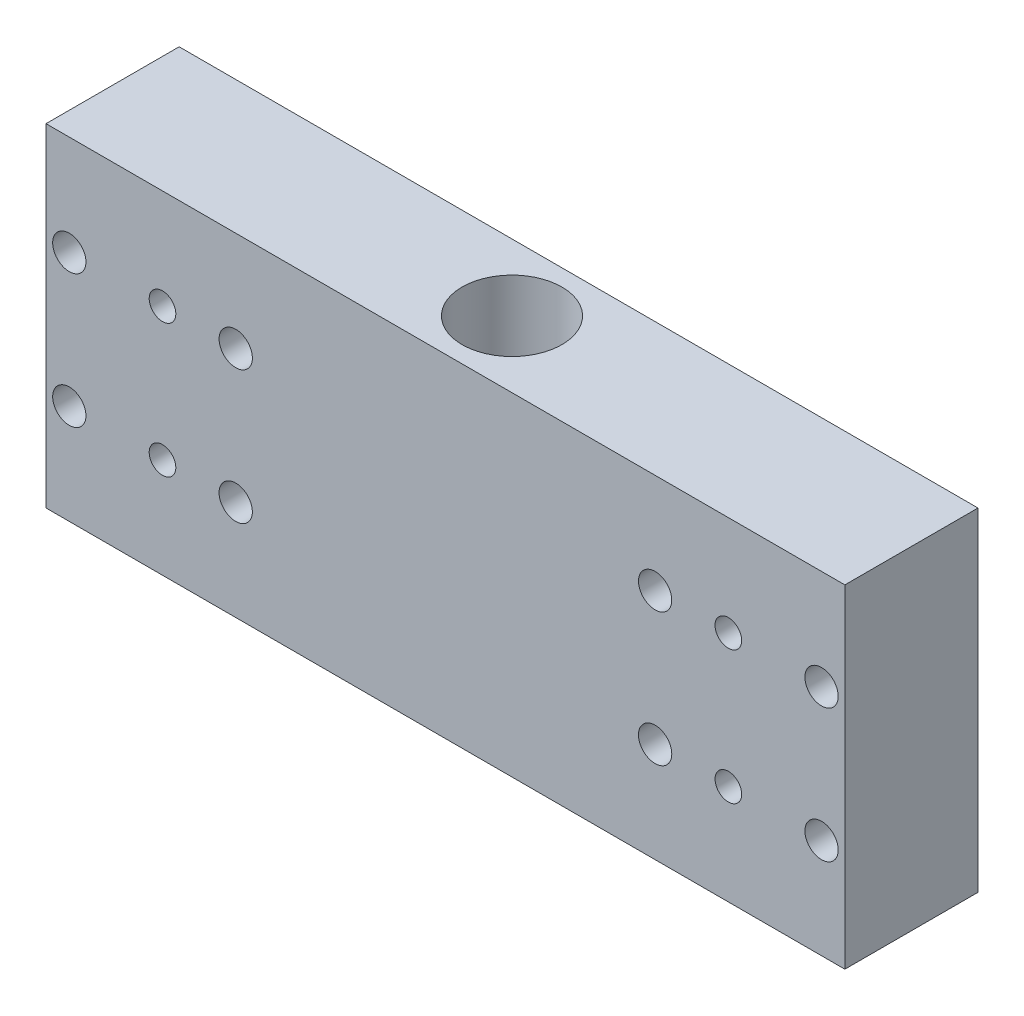
ISO-10303-21;
HEADER;
FILE_DESCRIPTION(('STEP AP214'),'2;1');
FILE_NAME('part.step','',(''),(''),'','','');
FILE_SCHEMA(('AUTOMOTIVE_DESIGN { 1 0 10303 214 1 1 1 1 }'));
ENDSEC;
DATA;
#1=APPLICATION_CONTEXT('core data for automotive mechanical design processes');
#2=APPLICATION_PROTOCOL_DEFINITION('international standard','automotive_design',2000,#1);
#3=PRODUCT_CONTEXT('',#1,'mechanical');
#4=PRODUCT('Part','Part','',(#3));
#5=PRODUCT_RELATED_PRODUCT_CATEGORY('part','',(#4));
#6=PRODUCT_DEFINITION_FORMATION('','',#4);
#7=PRODUCT_DEFINITION_CONTEXT('part definition',#1,'design');
#8=PRODUCT_DEFINITION('design','',#6,#7);
#9=PRODUCT_DEFINITION_SHAPE('','',#8);
#10=(LENGTH_UNIT() NAMED_UNIT(*) SI_UNIT(.MILLI.,.METRE.));
#11=(NAMED_UNIT(*) PLANE_ANGLE_UNIT() SI_UNIT($,.RADIAN.));
#12=(NAMED_UNIT(*) SI_UNIT($,.STERADIAN.) SOLID_ANGLE_UNIT());
#13=UNCERTAINTY_MEASURE_WITH_UNIT(LENGTH_MEASURE(1.E-05),#10,'distance_accuracy_value','');
#14=(GEOMETRIC_REPRESENTATION_CONTEXT(3) GLOBAL_UNCERTAINTY_ASSIGNED_CONTEXT((#13)) GLOBAL_UNIT_ASSIGNED_CONTEXT((#10,
#11,#12)) REPRESENTATION_CONTEXT('',''));
#15=CARTESIAN_POINT('',(0.,0.,0.));
#16=DIRECTION('',(0.,0.,1.));
#17=DIRECTION('',(1.,0.,0.));
#18=AXIS2_PLACEMENT_3D('',#15,#16,#17);
#19=CARTESIAN_POINT('',(-56.5,9.99999999999999,0.));
#20=DIRECTION('',(0.,0.,1.));
#21=DIRECTION('',(1.,0.,0.));
#22=AXIS2_PLACEMENT_3D('',#19,#20,#21);
#23=CYLINDRICAL_SURFACE('',#22,1.25);
#24=CARTESIAN_POINT('',(-56.5,9.99999999999999,0.));
#25=DIRECTION('',(0.,0.,1.));
#26=DIRECTION('',(1.,0.,0.));
#27=AXIS2_PLACEMENT_3D('',#24,#25,#26);
#28=CIRCLE('',#27,1.25);
#29=CARTESIAN_POINT('',(-55.25,9.99999999999999,0.));
#30=VERTEX_POINT('',#29);
#31=EDGE_CURVE('E103',#30,#30,#28,.T.);
#32=ORIENTED_EDGE('',*,*,#31,.F.);
#33=EDGE_LOOP('',(#32));
#34=FACE_BOUND('',#33,.T.);
#35=CARTESIAN_POINT('',(-56.5,9.99999999999999,15.));
#36=DIRECTION('',(0.,0.,1.));
#37=DIRECTION('',(1.,0.,0.));
#38=AXIS2_PLACEMENT_3D('',#35,#36,#37);
#39=CIRCLE('',#38,1.25);
#40=CARTESIAN_POINT('',(-55.25,9.99999999999999,15.));
#41=VERTEX_POINT('',#40);
#42=EDGE_CURVE('E37',#41,#41,#39,.F.);
#43=ORIENTED_EDGE('',*,*,#42,.F.);
#44=EDGE_LOOP('',(#43));
#45=FACE_BOUND('',#44,.T.);
#46=ADVANCED_FACE('F33',(#34,#45),#23,.F.);
#47=CARTESIAN_POINT('',(31.5,-9.99999999999999,0.));
#48=DIRECTION('',(0.,0.,1.));
#49=DIRECTION('',(1.,0.,0.));
#50=AXIS2_PLACEMENT_3D('',#47,#48,#49);
#51=CYLINDRICAL_SURFACE('',#50,1.25);
#52=CARTESIAN_POINT('',(31.5,-9.99999999999999,0.));
#53=DIRECTION('',(0.,0.,1.));
#54=DIRECTION('',(-1.,0.,0.));
#55=AXIS2_PLACEMENT_3D('',#52,#53,#54);
#56=CIRCLE('',#55,1.25);
#57=CARTESIAN_POINT('',(30.25,-9.99999999999999,0.));
#58=VERTEX_POINT('',#57);
#59=EDGE_CURVE('E141',#58,#58,#56,.T.);
#60=ORIENTED_EDGE('',*,*,#59,.F.);
#61=EDGE_LOOP('',(#60));
#62=FACE_BOUND('',#61,.T.);
#63=CARTESIAN_POINT('',(31.5,-9.99999999999999,15.));
#64=DIRECTION('',(0.,0.,1.));
#65=DIRECTION('',(1.,0.,0.));
#66=AXIS2_PLACEMENT_3D('',#63,#64,#65);
#67=CIRCLE('',#66,1.25);
#68=CARTESIAN_POINT('',(32.75,-9.99999999999999,15.));
#69=VERTEX_POINT('',#68);
#70=EDGE_CURVE('E122',#69,#69,#67,.F.);
#71=ORIENTED_EDGE('',*,*,#70,.F.);
#72=EDGE_LOOP('',(#71));
#73=FACE_BOUND('',#72,.T.);
#74=ADVANCED_FACE('F165',(#62,#73),#51,.F.);
#75=CARTESIAN_POINT('',(-31.5,9.99999999999999,0.));
#76=DIRECTION('',(0.,0.,1.));
#77=DIRECTION('',(1.,0.,0.));
#78=AXIS2_PLACEMENT_3D('',#75,#76,#77);
#79=CYLINDRICAL_SURFACE('',#78,1.25);
#80=CARTESIAN_POINT('',(-31.5,9.99999999999999,0.));
#81=DIRECTION('',(0.,0.,1.));
#82=DIRECTION('',(-1.,0.,0.));
#83=AXIS2_PLACEMENT_3D('',#80,#81,#82);
#84=CIRCLE('',#83,1.25);
#85=CARTESIAN_POINT('',(-32.75,9.99999999999999,0.));
#86=VERTEX_POINT('',#85);
#87=EDGE_CURVE('E152',#86,#86,#84,.T.);
#88=ORIENTED_EDGE('',*,*,#87,.F.);
#89=EDGE_LOOP('',(#88));
#90=FACE_BOUND('',#89,.T.);
#91=CARTESIAN_POINT('',(-31.5,9.99999999999999,15.));
#92=DIRECTION('',(0.,0.,1.));
#93=DIRECTION('',(1.,0.,0.));
#94=AXIS2_PLACEMENT_3D('',#91,#92,#93);
#95=CIRCLE('',#94,1.25);
#96=CARTESIAN_POINT('',(-30.25,9.99999999999999,15.));
#97=VERTEX_POINT('',#96);
#98=EDGE_CURVE('E119',#97,#97,#95,.F.);
#99=ORIENTED_EDGE('',*,*,#98,.F.);
#100=EDGE_LOOP('',(#99));
#101=FACE_BOUND('',#100,.T.);
#102=ADVANCED_FACE('F170',(#90,#101),#79,.F.);
#103=CARTESIAN_POINT('',(56.5,-10.,0.));
#104=DIRECTION('',(0.,0.,1.));
#105=DIRECTION('',(1.,0.,0.));
#106=AXIS2_PLACEMENT_3D('',#103,#104,#105);
#107=CYLINDRICAL_SURFACE('',#106,1.25);
#108=CARTESIAN_POINT('',(56.5,-10.,0.));
#109=DIRECTION('',(0.,0.,1.));
#110=DIRECTION('',(1.,0.,0.));
#111=AXIS2_PLACEMENT_3D('',#108,#109,#110);
#112=CIRCLE('',#111,1.25);
#113=CARTESIAN_POINT('',(57.75,-10.,0.));
#114=VERTEX_POINT('',#113);
#115=EDGE_CURVE('E149',#114,#114,#112,.T.);
#116=ORIENTED_EDGE('',*,*,#115,.F.);
#117=EDGE_LOOP('',(#116));
#118=FACE_BOUND('',#117,.T.);
#119=CARTESIAN_POINT('',(56.5,-10.,15.));
#120=DIRECTION('',(0.,0.,1.));
#121=DIRECTION('',(1.,0.,0.));
#122=AXIS2_PLACEMENT_3D('',#119,#120,#121);
#123=CIRCLE('',#122,1.25);
#124=CARTESIAN_POINT('',(57.75,-10.,15.));
#125=VERTEX_POINT('',#124);
#126=EDGE_CURVE('E109',#125,#125,#123,.F.);
#127=ORIENTED_EDGE('',*,*,#126,.F.);
#128=EDGE_LOOP('',(#127));
#129=FACE_BOUND('',#128,.T.);
#130=ADVANCED_FACE('F194',(#118,#129),#107,.F.);
#131=CARTESIAN_POINT('',(-60.,-25.,20.));
#132=DIRECTION('',(1.,0.,0.));
#133=DIRECTION('',(0.,0.,-1.));
#134=AXIS2_PLACEMENT_3D('',#131,#132,#133);
#135=PLANE('',#134);
#136=DIRECTION('',(0.,-1.,0.));
#137=VECTOR('',#136,1.);
#138=CARTESIAN_POINT('',(-60.,-25.,0.));
#139=LINE('',#138,#137);
#140=CARTESIAN_POINT('',(-60.,25.,0.));
#141=VERTEX_POINT('',#140);
#142=CARTESIAN_POINT('',(-60.,-25.,0.));
#143=VERTEX_POINT('',#142);
#144=EDGE_CURVE('E100',#141,#143,#139,.T.);
#145=ORIENTED_EDGE('',*,*,#144,.T.);
#146=DIRECTION('',(0.,0.,-1.));
#147=VECTOR('',#146,1.);
#148=CARTESIAN_POINT('',(-60.,-25.,20.));
#149=LINE('',#148,#147);
#150=CARTESIAN_POINT('',(-60.,-25.,20.));
#151=VERTEX_POINT('',#150);
#152=EDGE_CURVE('E11',#151,#143,#149,.T.);
#153=ORIENTED_EDGE('',*,*,#152,.F.);
#154=DIRECTION('',(0.,-1.,0.));
#155=VECTOR('',#154,1.);
#156=CARTESIAN_POINT('',(-60.,-25.,20.));
#157=LINE('',#156,#155);
#158=CARTESIAN_POINT('',(-60.,25.,20.));
#159=VERTEX_POINT('',#158);
#160=EDGE_CURVE('E87',#159,#151,#157,.T.);
#161=ORIENTED_EDGE('',*,*,#160,.F.);
#162=DIRECTION('',(0.,0.,-1.));
#163=VECTOR('',#162,1.);
#164=CARTESIAN_POINT('',(-60.,25.,20.));
#165=LINE('',#164,#163);
#166=EDGE_CURVE('E96',#159,#141,#165,.T.);
#167=ORIENTED_EDGE('',*,*,#166,.T.);
#168=EDGE_LOOP('',(#145,#153,#161,#167));
#169=FACE_BOUND('',#168,.T.);
#170=ADVANCED_FACE('F35',(#169),#135,.F.);
#171=CARTESIAN_POINT('',(60.,-25.,20.));
#172=DIRECTION('',(0.,1.,0.));
#173=DIRECTION('',(-1.,0.,0.));
#174=AXIS2_PLACEMENT_3D('',#171,#172,#173);
#175=PLANE('',#174);
#176=CARTESIAN_POINT('',(0.,-25.,10.));
#177=DIRECTION('',(0.,1.,0.));
#178=DIRECTION('',(-1.,0.,0.));
#179=AXIS2_PLACEMENT_3D('',#176,#177,#178);
#180=CIRCLE('',#179,7.5);
#181=CARTESIAN_POINT('',(-7.5,-25.,10.));
#182=VERTEX_POINT('',#181);
#183=EDGE_CURVE('E198',#182,#182,#180,.F.);
#184=ORIENTED_EDGE('',*,*,#183,.F.);
#185=EDGE_LOOP('',(#184));
#186=FACE_BOUND('',#185,.T.);
#187=DIRECTION('',(1.,0.,0.));
#188=VECTOR('',#187,1.);
#189=CARTESIAN_POINT('',(60.,-25.,0.));
#190=LINE('',#189,#188);
#191=CARTESIAN_POINT('',(60.,-25.,0.));
#192=VERTEX_POINT('',#191);
#193=EDGE_CURVE('E91',#143,#192,#190,.T.);
#194=ORIENTED_EDGE('',*,*,#193,.T.);
#195=DIRECTION('',(0.,0.,-1.));
#196=VECTOR('',#195,1.);
#197=CARTESIAN_POINT('',(60.,-25.,20.));
#198=LINE('',#197,#196);
#199=CARTESIAN_POINT('',(60.,-25.,20.));
#200=VERTEX_POINT('',#199);
#201=EDGE_CURVE('E43',#200,#192,#198,.T.);
#202=ORIENTED_EDGE('',*,*,#201,.F.);
#203=DIRECTION('',(1.,0.,0.));
#204=VECTOR('',#203,1.);
#205=CARTESIAN_POINT('',(60.,-25.,20.));
#206=LINE('',#205,#204);
#207=EDGE_CURVE('E82',#151,#200,#206,.T.);
#208=ORIENTED_EDGE('',*,*,#207,.F.);
#209=ORIENTED_EDGE('',*,*,#152,.T.);
#210=EDGE_LOOP('',(#194,#202,#208,#209));
#211=FACE_BOUND('',#210,.T.);
#212=ADVANCED_FACE('F90',(#186,#211),#175,.F.);
#213=CARTESIAN_POINT('',(60.,-25.,20.));
#214=DIRECTION('',(-1.,0.,0.));
#215=DIRECTION('',(0.,0.,1.));
#216=AXIS2_PLACEMENT_3D('',#213,#214,#215);
#217=PLANE('',#216);
#218=DIRECTION('',(0.,1.,0.));
#219=VECTOR('',#218,1.);
#220=CARTESIAN_POINT('',(60.,-25.,0.));
#221=LINE('',#220,#219);
#222=CARTESIAN_POINT('',(60.,25.,0.));
#223=VERTEX_POINT('',#222);
#224=EDGE_CURVE('E69',#192,#223,#221,.T.);
#225=ORIENTED_EDGE('',*,*,#224,.T.);
#226=DIRECTION('',(0.,0.,-1.));
#227=VECTOR('',#226,1.);
#228=CARTESIAN_POINT('',(60.,25.,20.));
#229=LINE('',#228,#227);
#230=CARTESIAN_POINT('',(60.,25.,20.));
#231=VERTEX_POINT('',#230);
#232=EDGE_CURVE('E92',#231,#223,#229,.T.);
#233=ORIENTED_EDGE('',*,*,#232,.F.);
#234=DIRECTION('',(0.,1.,0.));
#235=VECTOR('',#234,1.);
#236=CARTESIAN_POINT('',(60.,-25.,20.));
#237=LINE('',#236,#235);
#238=EDGE_CURVE('E85',#200,#231,#237,.T.);
#239=ORIENTED_EDGE('',*,*,#238,.F.);
#240=ORIENTED_EDGE('',*,*,#201,.T.);
#241=EDGE_LOOP('',(#225,#233,#239,#240));
#242=FACE_BOUND('',#241,.T.);
#243=ADVANCED_FACE('F94',(#242),#217,.F.);
#244=CARTESIAN_POINT('',(60.,25.,20.));
#245=DIRECTION('',(0.,-1.,0.));
#246=DIRECTION('',(1.,0.,0.));
#247=AXIS2_PLACEMENT_3D('',#244,#245,#246);
#248=PLANE('',#247);
#249=CARTESIAN_POINT('',(0.,25.,10.));
#250=DIRECTION('',(0.,1.,0.));
#251=DIRECTION('',(-1.,0.,0.));
#252=AXIS2_PLACEMENT_3D('',#249,#250,#251);
#253=CIRCLE('',#252,7.5);
#254=CARTESIAN_POINT('',(-7.5,25.,10.));
#255=VERTEX_POINT('',#254);
#256=EDGE_CURVE('E201',#255,#255,#253,.T.);
#257=ORIENTED_EDGE('',*,*,#256,.F.);
#258=EDGE_LOOP('',(#257));
#259=FACE_BOUND('',#258,.T.);
#260=DIRECTION('',(-1.,0.,0.));
#261=VECTOR('',#260,1.);
#262=CARTESIAN_POINT('',(60.,25.,0.));
#263=LINE('',#262,#261);
#264=EDGE_CURVE('E75',#223,#141,#263,.T.);
#265=ORIENTED_EDGE('',*,*,#264,.T.);
#266=ORIENTED_EDGE('',*,*,#166,.F.);
#267=DIRECTION('',(-1.,0.,0.));
#268=VECTOR('',#267,1.);
#269=CARTESIAN_POINT('',(60.,25.,20.));
#270=LINE('',#269,#268);
#271=EDGE_CURVE('E52',#231,#159,#270,.T.);
#272=ORIENTED_EDGE('',*,*,#271,.F.);
#273=ORIENTED_EDGE('',*,*,#232,.T.);
#274=EDGE_LOOP('',(#265,#266,#272,#273));
#275=FACE_BOUND('',#274,.T.);
#276=ADVANCED_FACE('F179',(#259,#275),#248,.F.);
#277=CARTESIAN_POINT('',(0.,0.,20.));
#278=DIRECTION('',(0.,0.,1.));
#279=DIRECTION('',(1.,0.,0.));
#280=AXIS2_PLACEMENT_3D('',#277,#278,#279);
#281=PLANE('',#280);
#282=CARTESIAN_POINT('',(-42.5,9.99999999999999,20.));
#283=DIRECTION('',(0.,0.,1.));
#284=DIRECTION('',(-1.,0.,0.));
#285=AXIS2_PLACEMENT_3D('',#282,#283,#284);
#286=CIRCLE('',#285,2.);
#287=CARTESIAN_POINT('',(-44.5,9.99999999999999,20.));
#288=VERTEX_POINT('',#287);
#289=EDGE_CURVE('E590',#288,#288,#286,.T.);
#290=ORIENTED_EDGE('',*,*,#289,.F.);
#291=EDGE_LOOP('',(#290));
#292=FACE_BOUND('',#291,.T.);
#293=CARTESIAN_POINT('',(-42.5,-10.,20.));
#294=DIRECTION('',(0.,0.,1.));
#295=DIRECTION('',(1.,0.,0.));
#296=AXIS2_PLACEMENT_3D('',#293,#294,#295);
#297=CIRCLE('',#296,2.);
#298=CARTESIAN_POINT('',(-40.5,-10.,20.));
#299=VERTEX_POINT('',#298);
#300=EDGE_CURVE('E594',#299,#299,#297,.T.);
#301=ORIENTED_EDGE('',*,*,#300,.F.);
#302=EDGE_LOOP('',(#301));
#303=FACE_BOUND('',#302,.T.);
#304=CARTESIAN_POINT('',(42.5,-10.,20.));
#305=DIRECTION('',(0.,0.,1.));
#306=DIRECTION('',(-1.,0.,0.));
#307=AXIS2_PLACEMENT_3D('',#304,#305,#306);
#308=CIRCLE('',#307,2.);
#309=CARTESIAN_POINT('',(40.5,-10.,20.));
#310=VERTEX_POINT('',#309);
#311=EDGE_CURVE('E622',#310,#310,#308,.T.);
#312=ORIENTED_EDGE('',*,*,#311,.F.);
#313=EDGE_LOOP('',(#312));
#314=FACE_BOUND('',#313,.T.);
#315=CARTESIAN_POINT('',(42.5,10.,20.));
#316=DIRECTION('',(0.,0.,1.));
#317=DIRECTION('',(1.,0.,0.));
#318=AXIS2_PLACEMENT_3D('',#315,#316,#317);
#319=CIRCLE('',#318,2.);
#320=CARTESIAN_POINT('',(44.5,10.,20.));
#321=VERTEX_POINT('',#320);
#322=EDGE_CURVE('E602',#321,#321,#319,.T.);
#323=ORIENTED_EDGE('',*,*,#322,.F.);
#324=EDGE_LOOP('',(#323));
#325=FACE_BOUND('',#324,.T.);
#326=CARTESIAN_POINT('',(56.5,9.99999999999999,20.));
#327=DIRECTION('',(0.,0.,1.));
#328=DIRECTION('',(-1.,0.,0.));
#329=AXIS2_PLACEMENT_3D('',#326,#327,#328);
#330=CIRCLE('',#329,2.5);
#331=CARTESIAN_POINT('',(54.,9.99999999999999,20.));
#332=VERTEX_POINT('',#331);
#333=EDGE_CURVE('E214',#332,#332,#330,.T.);
#334=ORIENTED_EDGE('',*,*,#333,.F.);
#335=EDGE_LOOP('',(#334));
#336=FACE_BOUND('',#335,.T.);
#337=CARTESIAN_POINT('',(-31.5,-10.,20.));
#338=DIRECTION('',(0.,0.,1.));
#339=DIRECTION('',(-1.,0.,0.));
#340=AXIS2_PLACEMENT_3D('',#337,#338,#339);
#341=CIRCLE('',#340,2.5);
#342=CARTESIAN_POINT('',(-34.,-10.,20.));
#343=VERTEX_POINT('',#342);
#344=EDGE_CURVE('E230',#343,#343,#341,.T.);
#345=ORIENTED_EDGE('',*,*,#344,.F.);
#346=EDGE_LOOP('',(#345));
#347=FACE_BOUND('',#346,.T.);
#348=CARTESIAN_POINT('',(-56.5,-10.,20.));
#349=DIRECTION('',(0.,0.,1.));
#350=DIRECTION('',(-1.,0.,0.));
#351=AXIS2_PLACEMENT_3D('',#348,#349,#350);
#352=CIRCLE('',#351,2.5);
#353=CARTESIAN_POINT('',(-59.,-10.,20.));
#354=VERTEX_POINT('',#353);
#355=EDGE_CURVE('E229',#354,#354,#352,.T.);
#356=ORIENTED_EDGE('',*,*,#355,.F.);
#357=EDGE_LOOP('',(#356));
#358=FACE_BOUND('',#357,.T.);
#359=CARTESIAN_POINT('',(-31.5,9.99999999999999,20.));
#360=DIRECTION('',(0.,0.,1.));
#361=DIRECTION('',(1.,0.,0.));
#362=AXIS2_PLACEMENT_3D('',#359,#360,#361);
#363=CIRCLE('',#362,2.5);
#364=CARTESIAN_POINT('',(-29.,9.99999999999999,20.));
#365=VERTEX_POINT('',#364);
#366=EDGE_CURVE('E242',#365,#365,#363,.T.);
#367=ORIENTED_EDGE('',*,*,#366,.F.);
#368=EDGE_LOOP('',(#367));
#369=FACE_BOUND('',#368,.T.);
#370=CARTESIAN_POINT('',(31.5,9.99999999999999,20.));
#371=DIRECTION('',(0.,0.,1.));
#372=DIRECTION('',(-1.,0.,0.));
#373=AXIS2_PLACEMENT_3D('',#370,#371,#372);
#374=CIRCLE('',#373,2.5);
#375=CARTESIAN_POINT('',(29.,9.99999999999999,20.));
#376=VERTEX_POINT('',#375);
#377=EDGE_CURVE('E215',#376,#376,#374,.T.);
#378=ORIENTED_EDGE('',*,*,#377,.F.);
#379=EDGE_LOOP('',(#378));
#380=FACE_BOUND('',#379,.T.);
#381=CARTESIAN_POINT('',(31.5,-10.,20.));
#382=DIRECTION('',(0.,0.,1.));
#383=DIRECTION('',(1.,0.,0.));
#384=AXIS2_PLACEMENT_3D('',#381,#382,#383);
#385=CIRCLE('',#384,2.5);
#386=CARTESIAN_POINT('',(34.,-10.,20.));
#387=VERTEX_POINT('',#386);
#388=EDGE_CURVE('E221',#387,#387,#385,.T.);
#389=ORIENTED_EDGE('',*,*,#388,.F.);
#390=EDGE_LOOP('',(#389));
#391=FACE_BOUND('',#390,.T.);
#392=CARTESIAN_POINT('',(56.5,-10.,20.));
#393=DIRECTION('',(0.,0.,1.));
#394=DIRECTION('',(1.,0.,0.));
#395=AXIS2_PLACEMENT_3D('',#392,#393,#394);
#396=CIRCLE('',#395,2.5);
#397=CARTESIAN_POINT('',(59.,-10.,20.));
#398=VERTEX_POINT('',#397);
#399=EDGE_CURVE('E200',#398,#398,#396,.T.);
#400=ORIENTED_EDGE('',*,*,#399,.F.);
#401=EDGE_LOOP('',(#400));
#402=FACE_BOUND('',#401,.T.);
#403=CARTESIAN_POINT('',(-56.5,9.99999999999999,20.));
#404=DIRECTION('',(0.,0.,1.));
#405=DIRECTION('',(1.,0.,0.));
#406=AXIS2_PLACEMENT_3D('',#403,#404,#405);
#407=CIRCLE('',#406,2.5);
#408=CARTESIAN_POINT('',(-54.,9.99999999999999,20.));
#409=VERTEX_POINT('',#408);
#410=EDGE_CURVE('E241',#409,#409,#407,.T.);
#411=ORIENTED_EDGE('',*,*,#410,.F.);
#412=EDGE_LOOP('',(#411));
#413=FACE_BOUND('',#412,.T.);
#414=ORIENTED_EDGE('',*,*,#160,.T.);
#415=ORIENTED_EDGE('',*,*,#207,.T.);
#416=ORIENTED_EDGE('',*,*,#238,.T.);
#417=ORIENTED_EDGE('',*,*,#271,.T.);
#418=EDGE_LOOP('',(#414,#415,#416,#417));
#419=FACE_BOUND('',#418,.T.);
#420=ADVANCED_FACE('F83',(#292,#303,#314,#325,#336,#347,#358,#369,#380,#391,#402,#413,#419),
#281,.T.);
#421=CARTESIAN_POINT('',(0.,0.,0.));
#422=DIRECTION('',(0.,0.,1.));
#423=DIRECTION('',(1.,0.,0.));
#424=AXIS2_PLACEMENT_3D('',#421,#422,#423);
#425=PLANE('',#424);
#426=CARTESIAN_POINT('',(-42.5,9.99999999999999,0.));
#427=DIRECTION('',(0.,0.,1.));
#428=DIRECTION('',(1.,0.,0.));
#429=AXIS2_PLACEMENT_3D('',#426,#427,#428);
#430=CIRCLE('',#429,2.);
#431=CARTESIAN_POINT('',(-40.5,9.99999999999999,0.));
#432=VERTEX_POINT('',#431);
#433=EDGE_CURVE('E593',#432,#432,#430,.F.);
#434=ORIENTED_EDGE('',*,*,#433,.F.);
#435=EDGE_LOOP('',(#434));
#436=FACE_BOUND('',#435,.T.);
#437=CARTESIAN_POINT('',(-42.5,-10.,0.));
#438=DIRECTION('',(0.,0.,1.));
#439=DIRECTION('',(1.,0.,0.));
#440=AXIS2_PLACEMENT_3D('',#437,#438,#439);
#441=CIRCLE('',#440,2.);
#442=CARTESIAN_POINT('',(-40.5,-10.,0.));
#443=VERTEX_POINT('',#442);
#444=EDGE_CURVE('E597',#443,#443,#441,.F.);
#445=ORIENTED_EDGE('',*,*,#444,.F.);
#446=EDGE_LOOP('',(#445));
#447=FACE_BOUND('',#446,.T.);
#448=CARTESIAN_POINT('',(42.5,-10.,0.));
#449=DIRECTION('',(0.,0.,1.));
#450=DIRECTION('',(1.,0.,0.));
#451=AXIS2_PLACEMENT_3D('',#448,#449,#450);
#452=CIRCLE('',#451,2.);
#453=CARTESIAN_POINT('',(44.5,-10.,0.));
#454=VERTEX_POINT('',#453);
#455=EDGE_CURVE('E604',#454,#454,#452,.F.);
#456=ORIENTED_EDGE('',*,*,#455,.F.);
#457=EDGE_LOOP('',(#456));
#458=FACE_BOUND('',#457,.T.);
#459=CARTESIAN_POINT('',(42.5,10.,0.));
#460=DIRECTION('',(0.,0.,1.));
#461=DIRECTION('',(1.,0.,0.));
#462=AXIS2_PLACEMENT_3D('',#459,#460,#461);
#463=CIRCLE('',#462,2.);
#464=CARTESIAN_POINT('',(44.5,10.,0.));
#465=VERTEX_POINT('',#464);
#466=EDGE_CURVE('E207',#465,#465,#463,.F.);
#467=ORIENTED_EDGE('',*,*,#466,.F.);
#468=EDGE_LOOP('',(#467));
#469=FACE_BOUND('',#468,.T.);
#470=ORIENTED_EDGE('',*,*,#115,.T.);
#471=EDGE_LOOP('',(#470));
#472=FACE_BOUND('',#471,.T.);
#473=CARTESIAN_POINT('',(-31.5,-9.99999999999999,0.));
#474=DIRECTION('',(0.,0.,1.));
#475=DIRECTION('',(1.,0.,0.));
#476=AXIS2_PLACEMENT_3D('',#473,#474,#475);
#477=CIRCLE('',#476,1.25);
#478=CARTESIAN_POINT('',(-30.25,-9.99999999999999,0.));
#479=VERTEX_POINT('',#478);
#480=EDGE_CURVE('E145',#479,#479,#477,.T.);
#481=ORIENTED_EDGE('',*,*,#480,.T.);
#482=EDGE_LOOP('',(#481));
#483=FACE_BOUND('',#482,.T.);
#484=CARTESIAN_POINT('',(-56.5,-10.,0.));
#485=DIRECTION('',(0.,0.,1.));
#486=DIRECTION('',(-1.,0.,0.));
#487=AXIS2_PLACEMENT_3D('',#484,#485,#486);
#488=CIRCLE('',#487,1.25);
#489=CARTESIAN_POINT('',(-57.75,-10.,0.));
#490=VERTEX_POINT('',#489);
#491=EDGE_CURVE('E148',#490,#490,#488,.T.);
#492=ORIENTED_EDGE('',*,*,#491,.T.);
#493=EDGE_LOOP('',(#492));
#494=FACE_BOUND('',#493,.T.);
#495=ORIENTED_EDGE('',*,*,#87,.T.);
#496=EDGE_LOOP('',(#495));
#497=FACE_BOUND('',#496,.T.);
#498=ORIENTED_EDGE('',*,*,#59,.T.);
#499=EDGE_LOOP('',(#498));
#500=FACE_BOUND('',#499,.T.);
#501=CARTESIAN_POINT('',(31.5,9.99999999999999,0.));
#502=DIRECTION('',(0.,0.,1.));
#503=DIRECTION('',(1.,0.,0.));
#504=AXIS2_PLACEMENT_3D('',#501,#502,#503);
#505=CIRCLE('',#504,1.25);
#506=CARTESIAN_POINT('',(32.75,9.99999999999999,0.));
#507=VERTEX_POINT('',#506);
#508=EDGE_CURVE('E136',#507,#507,#505,.T.);
#509=ORIENTED_EDGE('',*,*,#508,.T.);
#510=EDGE_LOOP('',(#509));
#511=FACE_BOUND('',#510,.T.);
#512=CARTESIAN_POINT('',(56.5,9.99999999999999,0.));
#513=DIRECTION('',(0.,0.,1.));
#514=DIRECTION('',(-1.,0.,0.));
#515=AXIS2_PLACEMENT_3D('',#512,#513,#514);
#516=CIRCLE('',#515,1.25);
#517=CARTESIAN_POINT('',(55.25,9.99999999999999,0.));
#518=VERTEX_POINT('',#517);
#519=EDGE_CURVE('E132',#518,#518,#516,.T.);
#520=ORIENTED_EDGE('',*,*,#519,.T.);
#521=EDGE_LOOP('',(#520));
#522=FACE_BOUND('',#521,.T.);
#523=ORIENTED_EDGE('',*,*,#31,.T.);
#524=EDGE_LOOP('',(#523));
#525=FACE_BOUND('',#524,.T.);
#526=ORIENTED_EDGE('',*,*,#144,.F.);
#527=ORIENTED_EDGE('',*,*,#264,.F.);
#528=ORIENTED_EDGE('',*,*,#224,.F.);
#529=ORIENTED_EDGE('',*,*,#193,.F.);
#530=EDGE_LOOP('',(#526,#527,#528,#529));
#531=FACE_BOUND('',#530,.T.);
#532=ADVANCED_FACE('F160',(#436,#447,#458,#469,#472,#483,#494,#497,#500,#511,#522,#525,#531),
#425,.F.);
#533=CARTESIAN_POINT('',(56.5,9.99999999999999,0.));
#534=DIRECTION('',(0.,0.,1.));
#535=DIRECTION('',(1.,0.,0.));
#536=AXIS2_PLACEMENT_3D('',#533,#534,#535);
#537=CYLINDRICAL_SURFACE('',#536,1.25);
#538=CARTESIAN_POINT('',(56.5,9.99999999999999,15.));
#539=DIRECTION('',(0.,0.,-1.));
#540=DIRECTION('',(-1.,0.,0.));
#541=AXIS2_PLACEMENT_3D('',#538,#539,#540);
#542=CIRCLE('',#541,1.25);
#543=CARTESIAN_POINT('',(55.25,9.99999999999999,15.));
#544=VERTEX_POINT('',#543);
#545=EDGE_CURVE('E127',#544,#544,#542,.F.);
#546=ORIENTED_EDGE('',*,*,#545,.T.);
#547=EDGE_LOOP('',(#546));
#548=FACE_BOUND('',#547,.T.);
#549=ORIENTED_EDGE('',*,*,#519,.F.);
#550=EDGE_LOOP('',(#549));
#551=FACE_BOUND('',#550,.T.);
#552=ADVANCED_FACE('F183',(#548,#551),#537,.F.);
#553=CARTESIAN_POINT('',(31.5,9.99999999999999,0.));
#554=DIRECTION('',(0.,0.,1.));
#555=DIRECTION('',(1.,0.,0.));
#556=AXIS2_PLACEMENT_3D('',#553,#554,#555);
#557=CYLINDRICAL_SURFACE('',#556,1.25);
#558=CARTESIAN_POINT('',(31.5,9.99999999999999,15.));
#559=DIRECTION('',(0.,0.,-1.));
#560=DIRECTION('',(-1.,0.,0.));
#561=AXIS2_PLACEMENT_3D('',#558,#559,#560);
#562=CIRCLE('',#561,1.25);
#563=CARTESIAN_POINT('',(30.25,9.99999999999999,15.));
#564=VERTEX_POINT('',#563);
#565=EDGE_CURVE('E125',#564,#564,#562,.F.);
#566=ORIENTED_EDGE('',*,*,#565,.T.);
#567=EDGE_LOOP('',(#566));
#568=FACE_BOUND('',#567,.T.);
#569=ORIENTED_EDGE('',*,*,#508,.F.);
#570=EDGE_LOOP('',(#569));
#571=FACE_BOUND('',#570,.T.);
#572=ADVANCED_FACE('F325',(#568,#571),#557,.F.);
#573=CARTESIAN_POINT('',(-56.5,-10.,0.));
#574=DIRECTION('',(0.,0.,1.));
#575=DIRECTION('',(1.,0.,0.));
#576=AXIS2_PLACEMENT_3D('',#573,#574,#575);
#577=CYLINDRICAL_SURFACE('',#576,1.25);
#578=CARTESIAN_POINT('',(-56.5,-10.,15.));
#579=DIRECTION('',(0.,0.,-1.));
#580=DIRECTION('',(-1.,0.,0.));
#581=AXIS2_PLACEMENT_3D('',#578,#579,#580);
#582=CIRCLE('',#581,1.25);
#583=CARTESIAN_POINT('',(-57.75,-10.,15.));
#584=VERTEX_POINT('',#583);
#585=EDGE_CURVE('E116',#584,#584,#582,.F.);
#586=ORIENTED_EDGE('',*,*,#585,.T.);
#587=EDGE_LOOP('',(#586));
#588=FACE_BOUND('',#587,.T.);
#589=ORIENTED_EDGE('',*,*,#491,.F.);
#590=EDGE_LOOP('',(#589));
#591=FACE_BOUND('',#590,.T.);
#592=ADVANCED_FACE('F175',(#588,#591),#577,.F.);
#593=CARTESIAN_POINT('',(-31.5,-9.99999999999999,0.));
#594=DIRECTION('',(0.,0.,1.));
#595=DIRECTION('',(1.,0.,0.));
#596=AXIS2_PLACEMENT_3D('',#593,#594,#595);
#597=CYLINDRICAL_SURFACE('',#596,1.25);
#598=CARTESIAN_POINT('',(-31.5,-9.99999999999999,15.));
#599=DIRECTION('',(0.,0.,-1.));
#600=DIRECTION('',(-1.,0.,0.));
#601=AXIS2_PLACEMENT_3D('',#598,#599,#600);
#602=CIRCLE('',#601,1.25);
#603=CARTESIAN_POINT('',(-32.75,-9.99999999999999,15.));
#604=VERTEX_POINT('',#603);
#605=EDGE_CURVE('E112',#604,#604,#602,.F.);
#606=ORIENTED_EDGE('',*,*,#605,.T.);
#607=EDGE_LOOP('',(#606));
#608=FACE_BOUND('',#607,.T.);
#609=ORIENTED_EDGE('',*,*,#480,.F.);
#610=EDGE_LOOP('',(#609));
#611=FACE_BOUND('',#610,.T.);
#612=ADVANCED_FACE('F284',(#608,#611),#597,.F.);
#613=CARTESIAN_POINT('',(56.5,-10.,15.));
#614=DIRECTION('',(0.,0.,1.));
#615=DIRECTION('',(1.,0.,0.));
#616=AXIS2_PLACEMENT_3D('',#613,#614,#615);
#617=PLANE('',#616);
#618=CARTESIAN_POINT('',(56.5,-10.,15.));
#619=DIRECTION('',(0.,0.,1.));
#620=DIRECTION('',(1.,0.,0.));
#621=AXIS2_PLACEMENT_3D('',#618,#619,#620);
#622=CIRCLE('',#621,2.5);
#623=CARTESIAN_POINT('',(59.,-10.,15.));
#624=VERTEX_POINT('',#623);
#625=EDGE_CURVE('E204',#624,#624,#622,.T.);
#626=ORIENTED_EDGE('',*,*,#625,.T.);
#627=EDGE_LOOP('',(#626));
#628=FACE_BOUND('',#627,.T.);
#629=ORIENTED_EDGE('',*,*,#126,.T.);
#630=EDGE_LOOP('',(#629));
#631=FACE_BOUND('',#630,.T.);
#632=ADVANCED_FACE('F280',(#628,#631),#617,.T.);
#633=CARTESIAN_POINT('',(56.5,-10.,15.));
#634=DIRECTION('',(0.,0.,1.));
#635=DIRECTION('',(1.,0.,0.));
#636=AXIS2_PLACEMENT_3D('',#633,#634,#635);
#637=CYLINDRICAL_SURFACE('',#636,2.5);
#638=ORIENTED_EDGE('',*,*,#625,.F.);
#639=EDGE_LOOP('',(#638));
#640=FACE_BOUND('',#639,.T.);
#641=ORIENTED_EDGE('',*,*,#399,.T.);
#642=EDGE_LOOP('',(#641));
#643=FACE_BOUND('',#642,.T.);
#644=ADVANCED_FACE('F283',(#640,#643),#637,.F.);
#645=CARTESIAN_POINT('',(-31.5,-10.,15.));
#646=DIRECTION('',(0.,0.,-1.));
#647=DIRECTION('',(-1.,0.,0.));
#648=AXIS2_PLACEMENT_3D('',#645,#646,#647);
#649=PLANE('',#648);
#650=CARTESIAN_POINT('',(-31.5,-10.,15.));
#651=DIRECTION('',(0.,0.,1.));
#652=DIRECTION('',(-1.,0.,0.));
#653=AXIS2_PLACEMENT_3D('',#650,#651,#652);
#654=CIRCLE('',#653,2.5);
#655=CARTESIAN_POINT('',(-34.,-10.,15.));
#656=VERTEX_POINT('',#655);
#657=EDGE_CURVE('E226',#656,#656,#654,.T.);
#658=ORIENTED_EDGE('',*,*,#657,.T.);
#659=EDGE_LOOP('',(#658));
#660=FACE_BOUND('',#659,.T.);
#661=ORIENTED_EDGE('',*,*,#605,.F.);
#662=EDGE_LOOP('',(#661));
#663=FACE_BOUND('',#662,.T.);
#664=ADVANCED_FACE('F288',(#660,#663),#649,.F.);
#665=CARTESIAN_POINT('',(-31.5,-10.,15.));
#666=DIRECTION('',(0.,0.,1.));
#667=DIRECTION('',(1.,0.,0.));
#668=AXIS2_PLACEMENT_3D('',#665,#666,#667);
#669=CYLINDRICAL_SURFACE('',#668,2.5);
#670=ORIENTED_EDGE('',*,*,#657,.F.);
#671=EDGE_LOOP('',(#670));
#672=FACE_BOUND('',#671,.T.);
#673=ORIENTED_EDGE('',*,*,#344,.T.);
#674=EDGE_LOOP('',(#673));
#675=FACE_BOUND('',#674,.T.);
#676=ADVANCED_FACE('F292',(#672,#675),#669,.F.);
#677=CARTESIAN_POINT('',(-56.5,-10.,15.));
#678=DIRECTION('',(0.,0.,-1.));
#679=DIRECTION('',(-1.,0.,0.));
#680=AXIS2_PLACEMENT_3D('',#677,#678,#679);
#681=PLANE('',#680);
#682=CARTESIAN_POINT('',(-56.5,-10.,15.));
#683=DIRECTION('',(0.,0.,1.));
#684=DIRECTION('',(-1.,0.,0.));
#685=AXIS2_PLACEMENT_3D('',#682,#683,#684);
#686=CIRCLE('',#685,2.5);
#687=CARTESIAN_POINT('',(-59.,-10.,15.));
#688=VERTEX_POINT('',#687);
#689=EDGE_CURVE('E245',#688,#688,#686,.T.);
#690=ORIENTED_EDGE('',*,*,#689,.T.);
#691=EDGE_LOOP('',(#690));
#692=FACE_BOUND('',#691,.T.);
#693=ORIENTED_EDGE('',*,*,#585,.F.);
#694=EDGE_LOOP('',(#693));
#695=FACE_BOUND('',#694,.T.);
#696=ADVANCED_FACE('F296',(#692,#695),#681,.F.);
#697=CARTESIAN_POINT('',(-56.5,-10.,15.));
#698=DIRECTION('',(0.,0.,1.));
#699=DIRECTION('',(1.,0.,0.));
#700=AXIS2_PLACEMENT_3D('',#697,#698,#699);
#701=CYLINDRICAL_SURFACE('',#700,2.5);
#702=ORIENTED_EDGE('',*,*,#689,.F.);
#703=EDGE_LOOP('',(#702));
#704=FACE_BOUND('',#703,.T.);
#705=ORIENTED_EDGE('',*,*,#355,.T.);
#706=EDGE_LOOP('',(#705));
#707=FACE_BOUND('',#706,.T.);
#708=ADVANCED_FACE('F308',(#704,#707),#701,.F.);
#709=CARTESIAN_POINT('',(-31.5,9.99999999999999,15.));
#710=DIRECTION('',(0.,0.,1.));
#711=DIRECTION('',(1.,0.,0.));
#712=AXIS2_PLACEMENT_3D('',#709,#710,#711);
#713=PLANE('',#712);
#714=CARTESIAN_POINT('',(-31.5,9.99999999999999,15.));
#715=DIRECTION('',(0.,0.,1.));
#716=DIRECTION('',(1.,0.,0.));
#717=AXIS2_PLACEMENT_3D('',#714,#715,#716);
#718=CIRCLE('',#717,2.5);
#719=CARTESIAN_POINT('',(-29.,9.99999999999999,15.));
#720=VERTEX_POINT('',#719);
#721=EDGE_CURVE('E238',#720,#720,#718,.T.);
#722=ORIENTED_EDGE('',*,*,#721,.T.);
#723=EDGE_LOOP('',(#722));
#724=FACE_BOUND('',#723,.T.);
#725=ORIENTED_EDGE('',*,*,#98,.T.);
#726=EDGE_LOOP('',(#725));
#727=FACE_BOUND('',#726,.T.);
#728=ADVANCED_FACE('F273',(#724,#727),#713,.T.);
#729=CARTESIAN_POINT('',(-31.5,9.99999999999999,15.));
#730=DIRECTION('',(0.,0.,1.));
#731=DIRECTION('',(1.,0.,0.));
#732=AXIS2_PLACEMENT_3D('',#729,#730,#731);
#733=CYLINDRICAL_SURFACE('',#732,2.5);
#734=ORIENTED_EDGE('',*,*,#721,.F.);
#735=EDGE_LOOP('',(#734));
#736=FACE_BOUND('',#735,.T.);
#737=ORIENTED_EDGE('',*,*,#366,.T.);
#738=EDGE_LOOP('',(#737));
#739=FACE_BOUND('',#738,.T.);
#740=ADVANCED_FACE('F263',(#736,#739),#733,.F.);
#741=CARTESIAN_POINT('',(31.5,-10.,15.));
#742=DIRECTION('',(0.,0.,1.));
#743=DIRECTION('',(1.,0.,0.));
#744=AXIS2_PLACEMENT_3D('',#741,#742,#743);
#745=PLANE('',#744);
#746=CARTESIAN_POINT('',(31.5,-10.,15.));
#747=DIRECTION('',(0.,0.,1.));
#748=DIRECTION('',(1.,0.,0.));
#749=AXIS2_PLACEMENT_3D('',#746,#747,#748);
#750=CIRCLE('',#749,2.5);
#751=CARTESIAN_POINT('',(34.,-10.,15.));
#752=VERTEX_POINT('',#751);
#753=EDGE_CURVE('E218',#752,#752,#750,.T.);
#754=ORIENTED_EDGE('',*,*,#753,.T.);
#755=EDGE_LOOP('',(#754));
#756=FACE_BOUND('',#755,.T.);
#757=ORIENTED_EDGE('',*,*,#70,.T.);
#758=EDGE_LOOP('',(#757));
#759=FACE_BOUND('',#758,.T.);
#760=ADVANCED_FACE('F260',(#756,#759),#745,.T.);
#761=CARTESIAN_POINT('',(31.5,-10.,15.));
#762=DIRECTION('',(0.,0.,1.));
#763=DIRECTION('',(1.,0.,0.));
#764=AXIS2_PLACEMENT_3D('',#761,#762,#763);
#765=CYLINDRICAL_SURFACE('',#764,2.5);
#766=ORIENTED_EDGE('',*,*,#753,.F.);
#767=EDGE_LOOP('',(#766));
#768=FACE_BOUND('',#767,.T.);
#769=ORIENTED_EDGE('',*,*,#388,.T.);
#770=EDGE_LOOP('',(#769));
#771=FACE_BOUND('',#770,.T.);
#772=ADVANCED_FACE('F262',(#768,#771),#765,.F.);
#773=CARTESIAN_POINT('',(31.5,9.99999999999999,15.));
#774=DIRECTION('',(0.,0.,-1.));
#775=DIRECTION('',(-1.,0.,0.));
#776=AXIS2_PLACEMENT_3D('',#773,#774,#775);
#777=PLANE('',#776);
#778=CARTESIAN_POINT('',(31.5,9.99999999999999,15.));
#779=DIRECTION('',(0.,0.,1.));
#780=DIRECTION('',(-1.,0.,0.));
#781=AXIS2_PLACEMENT_3D('',#778,#779,#780);
#782=CIRCLE('',#781,2.5);
#783=CARTESIAN_POINT('',(29.,9.99999999999999,15.));
#784=VERTEX_POINT('',#783);
#785=EDGE_CURVE('E211',#784,#784,#782,.T.);
#786=ORIENTED_EDGE('',*,*,#785,.T.);
#787=EDGE_LOOP('',(#786));
#788=FACE_BOUND('',#787,.T.);
#789=ORIENTED_EDGE('',*,*,#565,.F.);
#790=EDGE_LOOP('',(#789));
#791=FACE_BOUND('',#790,.T.);
#792=ADVANCED_FACE('F270',(#788,#791),#777,.F.);
#793=CARTESIAN_POINT('',(31.5,9.99999999999999,15.));
#794=DIRECTION('',(0.,0.,1.));
#795=DIRECTION('',(1.,0.,0.));
#796=AXIS2_PLACEMENT_3D('',#793,#794,#795);
#797=CYLINDRICAL_SURFACE('',#796,2.5);
#798=ORIENTED_EDGE('',*,*,#785,.F.);
#799=EDGE_LOOP('',(#798));
#800=FACE_BOUND('',#799,.T.);
#801=ORIENTED_EDGE('',*,*,#377,.T.);
#802=EDGE_LOOP('',(#801));
#803=FACE_BOUND('',#802,.T.);
#804=ADVANCED_FACE('F277',(#800,#803),#797,.F.);
#805=CARTESIAN_POINT('',(56.5,9.99999999999999,15.));
#806=DIRECTION('',(0.,0.,-1.));
#807=DIRECTION('',(-1.,0.,0.));
#808=AXIS2_PLACEMENT_3D('',#805,#806,#807);
#809=PLANE('',#808);
#810=CARTESIAN_POINT('',(56.5,9.99999999999999,15.));
#811=DIRECTION('',(0.,0.,1.));
#812=DIRECTION('',(-1.,0.,0.));
#813=AXIS2_PLACEMENT_3D('',#810,#811,#812);
#814=CIRCLE('',#813,2.5);
#815=CARTESIAN_POINT('',(54.,9.99999999999999,15.));
#816=VERTEX_POINT('',#815);
#817=EDGE_CURVE('E233',#816,#816,#814,.T.);
#818=ORIENTED_EDGE('',*,*,#817,.T.);
#819=EDGE_LOOP('',(#818));
#820=FACE_BOUND('',#819,.T.);
#821=ORIENTED_EDGE('',*,*,#545,.F.);
#822=EDGE_LOOP('',(#821));
#823=FACE_BOUND('',#822,.T.);
#824=ADVANCED_FACE('F298',(#820,#823),#809,.F.);
#825=CARTESIAN_POINT('',(56.5,9.99999999999999,15.));
#826=DIRECTION('',(0.,0.,1.));
#827=DIRECTION('',(1.,0.,0.));
#828=AXIS2_PLACEMENT_3D('',#825,#826,#827);
#829=CYLINDRICAL_SURFACE('',#828,2.5);
#830=ORIENTED_EDGE('',*,*,#817,.F.);
#831=EDGE_LOOP('',(#830));
#832=FACE_BOUND('',#831,.T.);
#833=ORIENTED_EDGE('',*,*,#333,.T.);
#834=EDGE_LOOP('',(#833));
#835=FACE_BOUND('',#834,.T.);
#836=ADVANCED_FACE('F301',(#832,#835),#829,.F.);
#837=CARTESIAN_POINT('',(-56.5,9.99999999999999,15.));
#838=DIRECTION('',(0.,0.,1.));
#839=DIRECTION('',(1.,0.,0.));
#840=AXIS2_PLACEMENT_3D('',#837,#838,#839);
#841=PLANE('',#840);
#842=CARTESIAN_POINT('',(-56.5,9.99999999999999,15.));
#843=DIRECTION('',(0.,0.,1.));
#844=DIRECTION('',(1.,0.,0.));
#845=AXIS2_PLACEMENT_3D('',#842,#843,#844);
#846=CIRCLE('',#845,2.5);
#847=CARTESIAN_POINT('',(-54.,9.99999999999999,15.));
#848=VERTEX_POINT('',#847);
#849=EDGE_CURVE('E113',#848,#848,#846,.T.);
#850=ORIENTED_EDGE('',*,*,#849,.T.);
#851=EDGE_LOOP('',(#850));
#852=FACE_BOUND('',#851,.T.);
#853=ORIENTED_EDGE('',*,*,#42,.T.);
#854=EDGE_LOOP('',(#853));
#855=FACE_BOUND('',#854,.T.);
#856=ADVANCED_FACE('F305',(#852,#855),#841,.T.);
#857=CARTESIAN_POINT('',(-56.5,9.99999999999999,15.));
#858=DIRECTION('',(0.,0.,1.));
#859=DIRECTION('',(1.,0.,0.));
#860=AXIS2_PLACEMENT_3D('',#857,#858,#859);
#861=CYLINDRICAL_SURFACE('',#860,2.5);
#862=ORIENTED_EDGE('',*,*,#849,.F.);
#863=EDGE_LOOP('',(#862));
#864=FACE_BOUND('',#863,.T.);
#865=ORIENTED_EDGE('',*,*,#410,.T.);
#866=EDGE_LOOP('',(#865));
#867=FACE_BOUND('',#866,.T.);
#868=ADVANCED_FACE('F319',(#864,#867),#861,.F.);
#869=CARTESIAN_POINT('',(0.,-25.001,10.));
#870=DIRECTION('',(0.,1.,0.));
#871=DIRECTION('',(-1.,0.,0.));
#872=AXIS2_PLACEMENT_3D('',#869,#870,#871);
#873=CYLINDRICAL_SURFACE('',#872,7.5);
#874=ORIENTED_EDGE('',*,*,#256,.T.);
#875=EDGE_LOOP('',(#874));
#876=FACE_BOUND('',#875,.T.);
#877=ORIENTED_EDGE('',*,*,#183,.T.);
#878=EDGE_LOOP('',(#877));
#879=FACE_BOUND('',#878,.T.);
#880=ADVANCED_FACE('F322',(#876,#879),#873,.F.);
#881=CARTESIAN_POINT('',(42.5,10.,-0.001000000000001));
#882=DIRECTION('',(0.,0.,1.));
#883=DIRECTION('',(1.,0.,0.));
#884=AXIS2_PLACEMENT_3D('',#881,#882,#883);
#885=CYLINDRICAL_SURFACE('',#884,2.);
#886=ORIENTED_EDGE('',*,*,#322,.T.);
#887=EDGE_LOOP('',(#886));
#888=FACE_BOUND('',#887,.T.);
#889=ORIENTED_EDGE('',*,*,#466,.T.);
#890=EDGE_LOOP('',(#889));
#891=FACE_BOUND('',#890,.T.);
#892=ADVANCED_FACE('F425',(#888,#891),#885,.F.);
#893=CARTESIAN_POINT('',(42.5,-10.,-0.001000000000001));
#894=DIRECTION('',(0.,0.,1.));
#895=DIRECTION('',(1.,0.,0.));
#896=AXIS2_PLACEMENT_3D('',#893,#894,#895);
#897=CYLINDRICAL_SURFACE('',#896,2.);
#898=ORIENTED_EDGE('',*,*,#311,.T.);
#899=EDGE_LOOP('',(#898));
#900=FACE_BOUND('',#899,.T.);
#901=ORIENTED_EDGE('',*,*,#455,.T.);
#902=EDGE_LOOP('',(#901));
#903=FACE_BOUND('',#902,.T.);
#904=ADVANCED_FACE('F437',(#900,#903),#897,.F.);
#905=CARTESIAN_POINT('',(-42.5,-10.,-0.001000000000001));
#906=DIRECTION('',(0.,0.,1.));
#907=DIRECTION('',(1.,0.,0.));
#908=AXIS2_PLACEMENT_3D('',#905,#906,#907);
#909=CYLINDRICAL_SURFACE('',#908,2.);
#910=ORIENTED_EDGE('',*,*,#300,.T.);
#911=EDGE_LOOP('',(#910));
#912=FACE_BOUND('',#911,.T.);
#913=ORIENTED_EDGE('',*,*,#444,.T.);
#914=EDGE_LOOP('',(#913));
#915=FACE_BOUND('',#914,.T.);
#916=ADVANCED_FACE('F444',(#912,#915),#909,.F.);
#917=CARTESIAN_POINT('',(-42.5,9.99999999999999,-0.001000000000001));
#918=DIRECTION('',(0.,0.,1.));
#919=DIRECTION('',(1.,0.,0.));
#920=AXIS2_PLACEMENT_3D('',#917,#918,#919);
#921=CYLINDRICAL_SURFACE('',#920,2.);
#922=ORIENTED_EDGE('',*,*,#289,.T.);
#923=EDGE_LOOP('',(#922));
#924=FACE_BOUND('',#923,.T.);
#925=ORIENTED_EDGE('',*,*,#433,.T.);
#926=EDGE_LOOP('',(#925));
#927=FACE_BOUND('',#926,.T.);
#928=ADVANCED_FACE('F452',(#924,#927),#921,.F.);
#929=CLOSED_SHELL('',(#46,#74,#102,#130,#170,#212,#243,#276,#420,#532,#552,#572,#592,#612,#632,
#644,#664,#676,#696,#708,#728,#740,#760,#772,#792,#804,#824,#836,#856,#868,#880,#892,#904,#916,#928));
#930=MANIFOLD_SOLID_BREP('B2',#929);
#931=ADVANCED_BREP_SHAPE_REPRESENTATION('',(#18,#930),#14);
#932=SHAPE_DEFINITION_REPRESENTATION(#9,#931);
ENDSEC;
END-ISO-10303-21;
